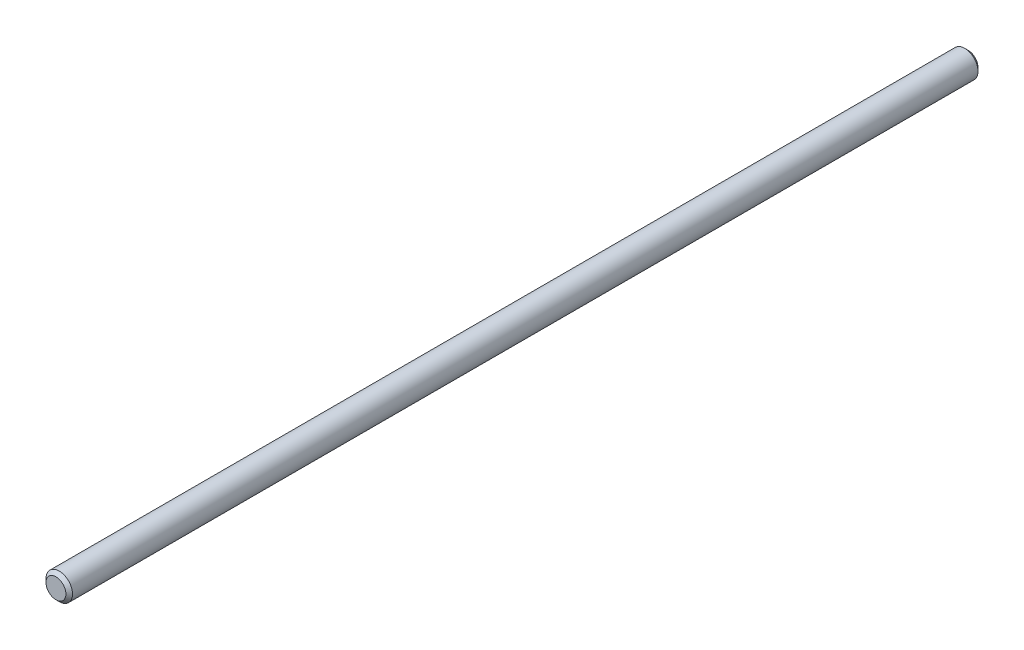
ISO-10303-21;
HEADER;
FILE_DESCRIPTION(('STEP AP214'),'2;1');
FILE_NAME('part.step','',(''),(''),'','','');
FILE_SCHEMA(('AUTOMOTIVE_DESIGN { 1 0 10303 214 1 1 1 1 }'));
ENDSEC;
DATA;
#1=APPLICATION_CONTEXT('core data for automotive mechanical design processes');
#2=APPLICATION_PROTOCOL_DEFINITION('international standard','automotive_design',2000,#1);
#3=PRODUCT_CONTEXT('',#1,'mechanical');
#4=PRODUCT('Part','Part','',(#3));
#5=PRODUCT_RELATED_PRODUCT_CATEGORY('part','',(#4));
#6=PRODUCT_DEFINITION_FORMATION('','',#4);
#7=PRODUCT_DEFINITION_CONTEXT('part definition',#1,'design');
#8=PRODUCT_DEFINITION('design','',#6,#7);
#9=PRODUCT_DEFINITION_SHAPE('','',#8);
#10=(LENGTH_UNIT() NAMED_UNIT(*) SI_UNIT(.MILLI.,.METRE.));
#11=(NAMED_UNIT(*) PLANE_ANGLE_UNIT() SI_UNIT($,.RADIAN.));
#12=(NAMED_UNIT(*) SI_UNIT($,.STERADIAN.) SOLID_ANGLE_UNIT());
#13=UNCERTAINTY_MEASURE_WITH_UNIT(LENGTH_MEASURE(1.E-05),#10,'distance_accuracy_value','');
#14=(GEOMETRIC_REPRESENTATION_CONTEXT(3) GLOBAL_UNCERTAINTY_ASSIGNED_CONTEXT((#13)) GLOBAL_UNIT_ASSIGNED_CONTEXT((#10,
#11,#12)) REPRESENTATION_CONTEXT('',''));
#15=CARTESIAN_POINT('',(0.,0.,0.));
#16=DIRECTION('',(0.,0.,1.));
#17=DIRECTION('',(1.,0.,0.));
#18=AXIS2_PLACEMENT_3D('',#15,#16,#17);
#19=CARTESIAN_POINT('',(0.,0.,275.));
#20=DIRECTION('',(0.,0.,-1.));
#21=DIRECTION('',(-1.,0.,0.));
#22=AXIS2_PLACEMENT_3D('',#19,#20,#21);
#23=CYLINDRICAL_SURFACE('',#22,4.);
#24=CARTESIAN_POINT('',(0.,0.,274.));
#25=DIRECTION('',(0.,0.,1.));
#26=DIRECTION('',(1.,0.,0.));
#27=AXIS2_PLACEMENT_3D('',#24,#25,#26);
#28=CIRCLE('',#27,4.);
#29=CARTESIAN_POINT('',(4.,0.,274.));
#30=VERTEX_POINT('',#29);
#31=EDGE_CURVE('E36',#30,#30,#28,.F.);
#32=ORIENTED_EDGE('',*,*,#31,.T.);
#33=EDGE_LOOP('',(#32));
#34=FACE_BOUND('',#33,.T.);
#35=CARTESIAN_POINT('',(0.,0.,1.00000000000006));
#36=DIRECTION('',(0.,0.,1.));
#37=DIRECTION('',(1.,0.,0.));
#38=AXIS2_PLACEMENT_3D('',#35,#36,#37);
#39=CIRCLE('',#38,4.);
#40=CARTESIAN_POINT('',(4.,0.,1.00000000000006));
#41=VERTEX_POINT('',#40);
#42=EDGE_CURVE('E40',#41,#41,#39,.T.);
#43=ORIENTED_EDGE('',*,*,#42,.T.);
#44=EDGE_LOOP('',(#43));
#45=FACE_BOUND('',#44,.T.);
#46=ADVANCED_FACE('F29',(#34,#45),#23,.T.);
#47=CARTESIAN_POINT('',(0.,0.,275.));
#48=DIRECTION('',(0.,0.,1.));
#49=DIRECTION('',(1.,0.,0.));
#50=AXIS2_PLACEMENT_3D('',#47,#48,#49);
#51=PLANE('',#50);
#52=CARTESIAN_POINT('',(0.,0.,275.));
#53=DIRECTION('',(0.,0.,1.));
#54=DIRECTION('',(1.,0.,0.));
#55=AXIS2_PLACEMENT_3D('',#52,#53,#54);
#56=CIRCLE('',#55,3.00000000000006);
#57=CARTESIAN_POINT('',(3.00000000000006,0.,275.));
#58=VERTEX_POINT('',#57);
#59=EDGE_CURVE('E44',#58,#58,#56,.T.);
#60=ORIENTED_EDGE('',*,*,#59,.T.);
#61=EDGE_LOOP('',(#60));
#62=FACE_BOUND('',#61,.T.);
#63=ADVANCED_FACE('F50',(#62),#51,.T.);
#64=CARTESIAN_POINT('',(0.,0.,0.));
#65=DIRECTION('',(0.,0.,1.));
#66=DIRECTION('',(1.,0.,0.));
#67=AXIS2_PLACEMENT_3D('',#64,#65,#66);
#68=PLANE('',#67);
#69=CARTESIAN_POINT('',(0.,0.,0.));
#70=DIRECTION('',(0.,0.,1.));
#71=DIRECTION('',(1.,0.,0.));
#72=AXIS2_PLACEMENT_3D('',#69,#70,#71);
#73=CIRCLE('',#72,2.99999999999998);
#74=CARTESIAN_POINT('',(2.99999999999998,0.,0.));
#75=VERTEX_POINT('',#74);
#76=EDGE_CURVE('E10',#75,#75,#73,.F.);
#77=ORIENTED_EDGE('',*,*,#76,.T.);
#78=EDGE_LOOP('',(#77));
#79=FACE_BOUND('',#78,.T.);
#80=ADVANCED_FACE('F54',(#79),#68,.F.);
#81=CARTESIAN_POINT('',(0.,0.,275.));
#82=DIRECTION('',(0.,0.,-1.));
#83=DIRECTION('',(-1.,0.,0.));
#84=AXIS2_PLACEMENT_3D('',#81,#82,#83);
#85=CONICAL_SURFACE('',#84,3.00000000000006,0.785398163397447);
#86=ORIENTED_EDGE('',*,*,#31,.F.);
#87=EDGE_LOOP('',(#86));
#88=FACE_BOUND('',#87,.T.);
#89=ORIENTED_EDGE('',*,*,#59,.F.);
#90=EDGE_LOOP('',(#89));
#91=FACE_BOUND('',#90,.T.);
#92=ADVANCED_FACE('F52',(#88,#91),#85,.T.);
#93=CARTESIAN_POINT('',(0.,0.,1.00000000000006));
#94=DIRECTION('',(0.,0.,1.));
#95=DIRECTION('',(1.,0.,0.));
#96=AXIS2_PLACEMENT_3D('',#93,#94,#95);
#97=CONICAL_SURFACE('',#96,4.,0.785398163397433);
#98=ORIENTED_EDGE('',*,*,#76,.F.);
#99=EDGE_LOOP('',(#98));
#100=FACE_BOUND('',#99,.T.);
#101=ORIENTED_EDGE('',*,*,#42,.F.);
#102=EDGE_LOOP('',(#101));
#103=FACE_BOUND('',#102,.T.);
#104=ADVANCED_FACE('F31',(#100,#103),#97,.T.);
#105=CLOSED_SHELL('',(#46,#63,#80,#92,#104));
#106=MANIFOLD_SOLID_BREP('B2',#105);
#107=ADVANCED_BREP_SHAPE_REPRESENTATION('',(#18,#106),#14);
#108=SHAPE_DEFINITION_REPRESENTATION(#9,#107);
ENDSEC;
END-ISO-10303-21;
